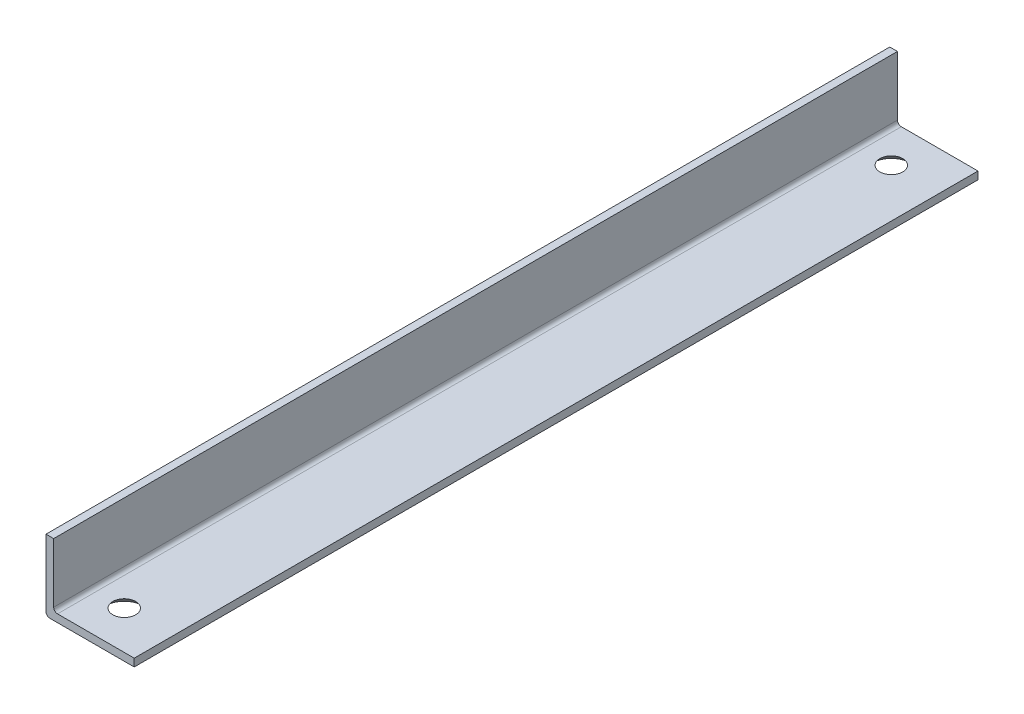
ISO-10303-21;
HEADER;
FILE_DESCRIPTION(('STEP AP214'),'2;1');
FILE_NAME('part.step','',(''),(''),'','','');
FILE_SCHEMA(('AUTOMOTIVE_DESIGN { 1 0 10303 214 1 1 1 1 }'));
ENDSEC;
DATA;
#1=APPLICATION_CONTEXT('core data for automotive mechanical design processes');
#2=APPLICATION_PROTOCOL_DEFINITION('international standard','automotive_design',2000,#1);
#3=PRODUCT_CONTEXT('',#1,'mechanical');
#4=PRODUCT('Part','Part','',(#3));
#5=PRODUCT_RELATED_PRODUCT_CATEGORY('part','',(#4));
#6=PRODUCT_DEFINITION_FORMATION('','',#4);
#7=PRODUCT_DEFINITION_CONTEXT('part definition',#1,'design');
#8=PRODUCT_DEFINITION('design','',#6,#7);
#9=PRODUCT_DEFINITION_SHAPE('','',#8);
#10=(LENGTH_UNIT() NAMED_UNIT(*) SI_UNIT(.MILLI.,.METRE.));
#11=(NAMED_UNIT(*) PLANE_ANGLE_UNIT() SI_UNIT($,.RADIAN.));
#12=(NAMED_UNIT(*) SI_UNIT($,.STERADIAN.) SOLID_ANGLE_UNIT());
#13=UNCERTAINTY_MEASURE_WITH_UNIT(LENGTH_MEASURE(1.E-05),#10,'distance_accuracy_value','');
#14=(GEOMETRIC_REPRESENTATION_CONTEXT(3) GLOBAL_UNCERTAINTY_ASSIGNED_CONTEXT((#13)) GLOBAL_UNIT_ASSIGNED_CONTEXT((#10,
#11,#12)) REPRESENTATION_CONTEXT('',''));
#15=CARTESIAN_POINT('',(0.,0.,0.));
#16=DIRECTION('',(0.,0.,1.));
#17=DIRECTION('',(1.,0.,0.));
#18=AXIS2_PLACEMENT_3D('',#15,#16,#17);
#19=CARTESIAN_POINT('',(0.,9.25,110.));
#20=DIRECTION('',(0.,-1.,0.));
#21=DIRECTION('',(0.,0.,-1.));
#22=AXIS2_PLACEMENT_3D('',#19,#20,#21);
#23=PLANE('',#22);
#24=DIRECTION('',(-1.,0.,0.));
#25=VECTOR('',#24,1.);
#26=CARTESIAN_POINT('',(0.,9.25,0.));
#27=LINE('',#26,#25);
#28=CARTESIAN_POINT('',(1.,9.25,0.));
#29=VERTEX_POINT('',#28);
#30=CARTESIAN_POINT('',(0.,9.25,0.));
#31=VERTEX_POINT('',#30);
#32=EDGE_CURVE('E131',#29,#31,#27,.T.);
#33=ORIENTED_EDGE('',*,*,#32,.T.);
#34=DIRECTION('',(0.,0.,-1.));
#35=VECTOR('',#34,1.);
#36=CARTESIAN_POINT('',(0.,9.25,110.));
#37=LINE('',#36,#35);
#38=CARTESIAN_POINT('',(0.,9.25,110.));
#39=VERTEX_POINT('',#38);
#40=EDGE_CURVE('E159',#39,#31,#37,.T.);
#41=ORIENTED_EDGE('',*,*,#40,.F.);
#42=DIRECTION('',(-1.,0.,0.));
#43=VECTOR('',#42,1.);
#44=CARTESIAN_POINT('',(0.,9.25,110.));
#45=LINE('',#44,#43);
#46=CARTESIAN_POINT('',(1.,9.25,110.));
#47=VERTEX_POINT('',#46);
#48=EDGE_CURVE('E146',#47,#39,#45,.T.);
#49=ORIENTED_EDGE('',*,*,#48,.F.);
#50=DIRECTION('',(0.,0.,-1.));
#51=VECTOR('',#50,1.);
#52=CARTESIAN_POINT('',(1.,9.25,110.));
#53=LINE('',#52,#51);
#54=EDGE_CURVE('E127',#47,#29,#53,.T.);
#55=ORIENTED_EDGE('',*,*,#54,.T.);
#56=EDGE_LOOP('',(#33,#41,#49,#55));
#57=FACE_BOUND('',#56,.T.);
#58=ADVANCED_FACE('F33',(#57),#23,.F.);
#59=CARTESIAN_POINT('',(0.,0.500000000000004,110.));
#60=DIRECTION('',(1.,0.,0.));
#61=DIRECTION('',(0.,0.,-1.));
#62=AXIS2_PLACEMENT_3D('',#59,#60,#61);
#63=PLANE('',#62);
#64=DIRECTION('',(0.,-1.,0.));
#65=VECTOR('',#64,1.);
#66=CARTESIAN_POINT('',(0.,0.500000000000004,0.));
#67=LINE('',#66,#65);
#68=CARTESIAN_POINT('',(0.,0.500000000000004,0.));
#69=VERTEX_POINT('',#68);
#70=EDGE_CURVE('E134',#31,#69,#67,.T.);
#71=ORIENTED_EDGE('',*,*,#70,.T.);
#72=DIRECTION('',(0.,0.,-1.));
#73=VECTOR('',#72,1.);
#74=CARTESIAN_POINT('',(0.,0.500000000000004,110.));
#75=LINE('',#74,#73);
#76=CARTESIAN_POINT('',(0.,0.500000000000004,110.));
#77=VERTEX_POINT('',#76);
#78=EDGE_CURVE('E156',#77,#69,#75,.T.);
#79=ORIENTED_EDGE('',*,*,#78,.F.);
#80=DIRECTION('',(0.,-1.,0.));
#81=VECTOR('',#80,1.);
#82=CARTESIAN_POINT('',(0.,0.500000000000004,110.));
#83=LINE('',#82,#81);
#84=EDGE_CURVE('E94',#39,#77,#83,.T.);
#85=ORIENTED_EDGE('',*,*,#84,.F.);
#86=ORIENTED_EDGE('',*,*,#40,.T.);
#87=EDGE_LOOP('',(#71,#79,#85,#86));
#88=FACE_BOUND('',#87,.T.);
#89=ADVANCED_FACE('F189',(#88),#63,.F.);
#90=CARTESIAN_POINT('',(0.5,0.5,110.));
#91=DIRECTION('',(0.,0.,-1.));
#92=DIRECTION('',(-1.,0.,0.));
#93=AXIS2_PLACEMENT_3D('',#90,#91,#92);
#94=CYLINDRICAL_SURFACE('',#93,0.5);
#95=CARTESIAN_POINT('',(0.5,0.5,0.));
#96=DIRECTION('',(0.,0.,1.));
#97=DIRECTION('',(-1.,0.,0.));
#98=AXIS2_PLACEMENT_3D('',#95,#96,#97);
#99=CIRCLE('',#98,0.5);
#100=CARTESIAN_POINT('',(0.500000000000004,0.,0.));
#101=VERTEX_POINT('',#100);
#102=EDGE_CURVE('E137',#69,#101,#99,.T.);
#103=ORIENTED_EDGE('',*,*,#102,.T.);
#104=DIRECTION('',(0.,0.,-1.));
#105=VECTOR('',#104,1.);
#106=CARTESIAN_POINT('',(0.500000000000004,0.,110.));
#107=LINE('',#106,#105);
#108=CARTESIAN_POINT('',(0.500000000000004,0.,110.));
#109=VERTEX_POINT('',#108);
#110=EDGE_CURVE('E153',#109,#101,#107,.T.);
#111=ORIENTED_EDGE('',*,*,#110,.F.);
#112=CARTESIAN_POINT('',(0.5,0.5,110.));
#113=DIRECTION('',(0.,0.,1.));
#114=DIRECTION('',(-1.,0.,0.));
#115=AXIS2_PLACEMENT_3D('',#112,#113,#114);
#116=CIRCLE('',#115,0.5);
#117=EDGE_CURVE('E227',#77,#109,#116,.T.);
#118=ORIENTED_EDGE('',*,*,#117,.F.);
#119=ORIENTED_EDGE('',*,*,#78,.T.);
#120=EDGE_LOOP('',(#103,#111,#118,#119));
#121=FACE_BOUND('',#120,.T.);
#122=ADVANCED_FACE('F195',(#121),#94,.T.);
#123=CARTESIAN_POINT('',(11.5,0.,110.));
#124=DIRECTION('',(0.,1.,0.));
#125=DIRECTION('',(-1.,0.,0.));
#126=AXIS2_PLACEMENT_3D('',#123,#124,#125);
#127=PLANE('',#126);
#128=CARTESIAN_POINT('',(5.2,0.,105.));
#129=DIRECTION('',(0.,1.,0.));
#130=DIRECTION('',(-1.,0.,0.));
#131=AXIS2_PLACEMENT_3D('',#128,#129,#130);
#132=CIRCLE('',#131,2.5);
#133=CARTESIAN_POINT('',(2.7,0.,105.));
#134=VERTEX_POINT('',#133);
#135=EDGE_CURVE('E11',#134,#134,#132,.T.);
#136=ORIENTED_EDGE('',*,*,#135,.T.);
#137=EDGE_LOOP('',(#136));
#138=FACE_BOUND('',#137,.T.);
#139=CARTESIAN_POINT('',(5.2,0.,5.));
#140=DIRECTION('',(0.,1.,0.));
#141=DIRECTION('',(-1.,0.,0.));
#142=AXIS2_PLACEMENT_3D('',#139,#140,#141);
#143=CIRCLE('',#142,2.5);
#144=CARTESIAN_POINT('',(2.7,0.,5.));
#145=VERTEX_POINT('',#144);
#146=EDGE_CURVE('E42',#145,#145,#143,.T.);
#147=ORIENTED_EDGE('',*,*,#146,.T.);
#148=EDGE_LOOP('',(#147));
#149=FACE_BOUND('',#148,.T.);
#150=DIRECTION('',(1.,0.,0.));
#151=VECTOR('',#150,1.);
#152=CARTESIAN_POINT('',(11.5,0.,0.));
#153=LINE('',#152,#151);
#154=CARTESIAN_POINT('',(11.5,0.,0.));
#155=VERTEX_POINT('',#154);
#156=EDGE_CURVE('E139',#101,#155,#153,.T.);
#157=ORIENTED_EDGE('',*,*,#156,.T.);
#158=DIRECTION('',(0.,0.,-1.));
#159=VECTOR('',#158,1.);
#160=CARTESIAN_POINT('',(11.5,0.,110.));
#161=LINE('',#160,#159);
#162=CARTESIAN_POINT('',(11.5,0.,110.));
#163=VERTEX_POINT('',#162);
#164=EDGE_CURVE('E150',#163,#155,#161,.T.);
#165=ORIENTED_EDGE('',*,*,#164,.F.);
#166=DIRECTION('',(1.,0.,0.));
#167=VECTOR('',#166,1.);
#168=CARTESIAN_POINT('',(11.5,0.,110.));
#169=LINE('',#168,#167);
#170=EDGE_CURVE('E224',#109,#163,#169,.T.);
#171=ORIENTED_EDGE('',*,*,#170,.F.);
#172=ORIENTED_EDGE('',*,*,#110,.T.);
#173=EDGE_LOOP('',(#157,#165,#171,#172));
#174=FACE_BOUND('',#173,.T.);
#175=ADVANCED_FACE('F168',(#138,#149,#174),#127,.F.);
#176=CARTESIAN_POINT('',(11.5,0.999999999999999,110.));
#177=DIRECTION('',(-1.,0.,0.));
#178=DIRECTION('',(0.,0.,1.));
#179=AXIS2_PLACEMENT_3D('',#176,#177,#178);
#180=PLANE('',#179);
#181=DIRECTION('',(0.,1.,0.));
#182=VECTOR('',#181,1.);
#183=CARTESIAN_POINT('',(11.5,0.999999999999999,0.));
#184=LINE('',#183,#182);
#185=CARTESIAN_POINT('',(11.5,0.999999999999999,0.));
#186=VERTEX_POINT('',#185);
#187=EDGE_CURVE('E141',#155,#186,#184,.T.);
#188=ORIENTED_EDGE('',*,*,#187,.T.);
#189=DIRECTION('',(0.,0.,-1.));
#190=VECTOR('',#189,1.);
#191=CARTESIAN_POINT('',(11.5,0.999999999999999,110.));
#192=LINE('',#191,#190);
#193=CARTESIAN_POINT('',(11.5,0.999999999999999,110.));
#194=VERTEX_POINT('',#193);
#195=EDGE_CURVE('E122',#194,#186,#192,.T.);
#196=ORIENTED_EDGE('',*,*,#195,.F.);
#197=DIRECTION('',(0.,1.,0.));
#198=VECTOR('',#197,1.);
#199=CARTESIAN_POINT('',(11.5,0.999999999999999,110.));
#200=LINE('',#199,#198);
#201=EDGE_CURVE('E113',#163,#194,#200,.T.);
#202=ORIENTED_EDGE('',*,*,#201,.F.);
#203=ORIENTED_EDGE('',*,*,#164,.T.);
#204=EDGE_LOOP('',(#188,#196,#202,#203));
#205=FACE_BOUND('',#204,.T.);
#206=ADVANCED_FACE('F177',(#205),#180,.F.);
#207=CARTESIAN_POINT('',(1.5,0.999999999999999,110.));
#208=DIRECTION('',(0.,-1.,0.));
#209=DIRECTION('',(0.,0.,-1.));
#210=AXIS2_PLACEMENT_3D('',#207,#208,#209);
#211=PLANE('',#210);
#212=CARTESIAN_POINT('',(5.2,0.999999999999998,105.));
#213=DIRECTION('',(0.,-1.,0.));
#214=DIRECTION('',(0.,0.,-1.));
#215=AXIS2_PLACEMENT_3D('',#212,#213,#214);
#216=CIRCLE('',#215,1.5);
#217=CARTESIAN_POINT('',(5.2,0.999999999999998,103.5));
#218=VERTEX_POINT('',#217);
#219=EDGE_CURVE('E163',#218,#218,#216,.T.);
#220=ORIENTED_EDGE('',*,*,#219,.T.);
#221=EDGE_LOOP('',(#220));
#222=FACE_BOUND('',#221,.T.);
#223=CARTESIAN_POINT('',(5.2,0.999999999999998,5.));
#224=DIRECTION('',(0.,-1.,0.));
#225=DIRECTION('',(0.,0.,-1.));
#226=AXIS2_PLACEMENT_3D('',#223,#224,#225);
#227=CIRCLE('',#226,1.5);
#228=CARTESIAN_POINT('',(5.2,0.999999999999998,3.5));
#229=VERTEX_POINT('',#228);
#230=EDGE_CURVE('E135',#229,#229,#227,.T.);
#231=ORIENTED_EDGE('',*,*,#230,.T.);
#232=EDGE_LOOP('',(#231));
#233=FACE_BOUND('',#232,.T.);
#234=DIRECTION('',(-1.,0.,0.));
#235=VECTOR('',#234,1.);
#236=CARTESIAN_POINT('',(1.5,0.999999999999999,0.));
#237=LINE('',#236,#235);
#238=CARTESIAN_POINT('',(1.5,0.999999999999999,0.));
#239=VERTEX_POINT('',#238);
#240=EDGE_CURVE('E121',#186,#239,#237,.T.);
#241=ORIENTED_EDGE('',*,*,#240,.T.);
#242=DIRECTION('',(0.,0.,-1.));
#243=VECTOR('',#242,1.);
#244=CARTESIAN_POINT('',(1.5,0.999999999999999,110.));
#245=LINE('',#244,#243);
#246=CARTESIAN_POINT('',(1.5,0.999999999999999,110.));
#247=VERTEX_POINT('',#246);
#248=EDGE_CURVE('E118',#247,#239,#245,.T.);
#249=ORIENTED_EDGE('',*,*,#248,.F.);
#250=DIRECTION('',(-1.,0.,0.));
#251=VECTOR('',#250,1.);
#252=CARTESIAN_POINT('',(1.5,0.999999999999999,110.));
#253=LINE('',#252,#251);
#254=EDGE_CURVE('E107',#194,#247,#253,.T.);
#255=ORIENTED_EDGE('',*,*,#254,.F.);
#256=ORIENTED_EDGE('',*,*,#195,.T.);
#257=EDGE_LOOP('',(#241,#249,#255,#256));
#258=FACE_BOUND('',#257,.T.);
#259=ADVANCED_FACE('F119',(#222,#233,#258),#211,.F.);
#260=CARTESIAN_POINT('',(1.5,1.5,110.));
#261=DIRECTION('',(0.,0.,-1.));
#262=DIRECTION('',(-1.,0.,0.));
#263=AXIS2_PLACEMENT_3D('',#260,#261,#262);
#264=CYLINDRICAL_SURFACE('',#263,0.5);
#265=CARTESIAN_POINT('',(1.5,1.5,0.));
#266=DIRECTION('',(0.,0.,-1.));
#267=DIRECTION('',(1.,0.,0.));
#268=AXIS2_PLACEMENT_3D('',#265,#266,#267);
#269=CIRCLE('',#268,0.5);
#270=CARTESIAN_POINT('',(1.,1.5,0.));
#271=VERTEX_POINT('',#270);
#272=EDGE_CURVE('E79',#239,#271,#269,.T.);
#273=ORIENTED_EDGE('',*,*,#272,.T.);
#274=DIRECTION('',(0.,0.,-1.));
#275=VECTOR('',#274,1.);
#276=CARTESIAN_POINT('',(1.,1.5,110.));
#277=LINE('',#276,#275);
#278=CARTESIAN_POINT('',(1.,1.5,110.));
#279=VERTEX_POINT('',#278);
#280=EDGE_CURVE('E123',#279,#271,#277,.T.);
#281=ORIENTED_EDGE('',*,*,#280,.F.);
#282=CARTESIAN_POINT('',(1.5,1.5,110.));
#283=DIRECTION('',(0.,0.,-1.));
#284=DIRECTION('',(1.,0.,0.));
#285=AXIS2_PLACEMENT_3D('',#282,#283,#284);
#286=CIRCLE('',#285,0.5);
#287=EDGE_CURVE('E111',#247,#279,#286,.T.);
#288=ORIENTED_EDGE('',*,*,#287,.F.);
#289=ORIENTED_EDGE('',*,*,#248,.T.);
#290=EDGE_LOOP('',(#273,#281,#288,#289));
#291=FACE_BOUND('',#290,.T.);
#292=ADVANCED_FACE('F125',(#291),#264,.F.);
#293=CARTESIAN_POINT('',(1.,9.25,110.));
#294=DIRECTION('',(-1.,0.,0.));
#295=DIRECTION('',(0.,-1.,0.));
#296=AXIS2_PLACEMENT_3D('',#293,#294,#295);
#297=PLANE('',#296);
#298=DIRECTION('',(0.,1.,0.));
#299=VECTOR('',#298,1.);
#300=CARTESIAN_POINT('',(1.,9.25,0.));
#301=LINE('',#300,#299);
#302=EDGE_CURVE('E85',#271,#29,#301,.T.);
#303=ORIENTED_EDGE('',*,*,#302,.T.);
#304=ORIENTED_EDGE('',*,*,#54,.F.);
#305=DIRECTION('',(0.,1.,0.));
#306=VECTOR('',#305,1.);
#307=CARTESIAN_POINT('',(1.,9.25,110.));
#308=LINE('',#307,#306);
#309=EDGE_CURVE('E50',#279,#47,#308,.T.);
#310=ORIENTED_EDGE('',*,*,#309,.F.);
#311=ORIENTED_EDGE('',*,*,#280,.T.);
#312=EDGE_LOOP('',(#303,#304,#310,#311));
#313=FACE_BOUND('',#312,.T.);
#314=ADVANCED_FACE('F184',(#313),#297,.F.);
#315=CARTESIAN_POINT('',(1.5,1.5,110.));
#316=DIRECTION('',(0.,0.,1.));
#317=DIRECTION('',(1.,0.,0.));
#318=AXIS2_PLACEMENT_3D('',#315,#316,#317);
#319=PLANE('',#318);
#320=ORIENTED_EDGE('',*,*,#48,.T.);
#321=ORIENTED_EDGE('',*,*,#84,.T.);
#322=ORIENTED_EDGE('',*,*,#117,.T.);
#323=ORIENTED_EDGE('',*,*,#170,.T.);
#324=ORIENTED_EDGE('',*,*,#201,.T.);
#325=ORIENTED_EDGE('',*,*,#254,.T.);
#326=ORIENTED_EDGE('',*,*,#287,.T.);
#327=ORIENTED_EDGE('',*,*,#309,.T.);
#328=EDGE_LOOP('',(#320,#321,#322,#323,#324,#325,#326,#327));
#329=FACE_BOUND('',#328,.T.);
#330=ADVANCED_FACE('F109',(#329),#319,.T.);
#331=CARTESIAN_POINT('',(1.5,1.5,0.));
#332=DIRECTION('',(0.,0.,1.));
#333=DIRECTION('',(1.,0.,0.));
#334=AXIS2_PLACEMENT_3D('',#331,#332,#333);
#335=PLANE('',#334);
#336=ORIENTED_EDGE('',*,*,#32,.F.);
#337=ORIENTED_EDGE('',*,*,#302,.F.);
#338=ORIENTED_EDGE('',*,*,#272,.F.);
#339=ORIENTED_EDGE('',*,*,#240,.F.);
#340=ORIENTED_EDGE('',*,*,#187,.F.);
#341=ORIENTED_EDGE('',*,*,#156,.F.);
#342=ORIENTED_EDGE('',*,*,#102,.F.);
#343=ORIENTED_EDGE('',*,*,#70,.F.);
#344=EDGE_LOOP('',(#336,#337,#338,#339,#340,#341,#342,#343));
#345=FACE_BOUND('',#344,.T.);
#346=ADVANCED_FACE('F199',(#345),#335,.F.);
#347=CARTESIAN_POINT('',(5.2,0.999999999999993,105.));
#348=DIRECTION('',(0.,-1.,0.));
#349=DIRECTION('',(0.,0.,-1.));
#350=AXIS2_PLACEMENT_3D('',#347,#348,#349);
#351=CONICAL_SURFACE('',#350,1.5,0.785398163397453);
#352=ORIENTED_EDGE('',*,*,#135,.F.);
#353=EDGE_LOOP('',(#352));
#354=FACE_BOUND('',#353,.T.);
#355=ORIENTED_EDGE('',*,*,#219,.F.);
#356=EDGE_LOOP('',(#355));
#357=FACE_BOUND('',#356,.T.);
#358=ADVANCED_FACE('F173',(#354,#357),#351,.F.);
#359=CARTESIAN_POINT('',(5.2,0.999999999999994,5.));
#360=DIRECTION('',(0.,-1.,0.));
#361=DIRECTION('',(0.,0.,-1.));
#362=AXIS2_PLACEMENT_3D('',#359,#360,#361);
#363=CONICAL_SURFACE('',#362,1.5,0.785398163397453);
#364=ORIENTED_EDGE('',*,*,#146,.F.);
#365=EDGE_LOOP('',(#364));
#366=FACE_BOUND('',#365,.T.);
#367=ORIENTED_EDGE('',*,*,#230,.F.);
#368=EDGE_LOOP('',(#367));
#369=FACE_BOUND('',#368,.T.);
#370=ADVANCED_FACE('F35',(#366,#369),#363,.F.);
#371=CLOSED_SHELL('',(#58,#89,#122,#175,#206,#259,#292,#314,#330,#346,#358,#370));
#372=MANIFOLD_SOLID_BREP('B2',#371);
#373=ADVANCED_BREP_SHAPE_REPRESENTATION('',(#18,#372),#14);
#374=SHAPE_DEFINITION_REPRESENTATION(#9,#373);
ENDSEC;
END-ISO-10303-21;
